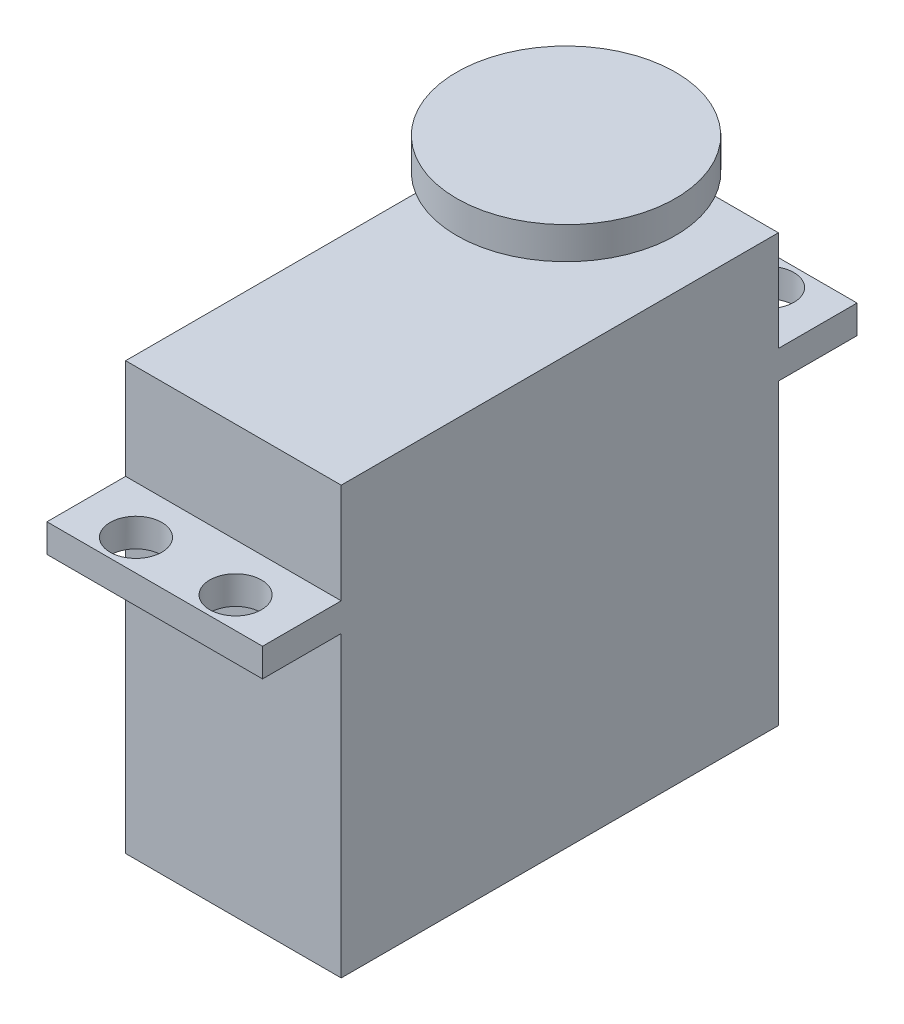
ISO-10303-21;
HEADER;
FILE_DESCRIPTION(('STEP AP214'),'2;1');
FILE_NAME('part.step','',(''),(''),'','','');
FILE_SCHEMA(('AUTOMOTIVE_DESIGN { 1 0 10303 214 1 1 1 1 }'));
ENDSEC;
DATA;
#1=APPLICATION_CONTEXT('core data for automotive mechanical design processes');
#2=APPLICATION_PROTOCOL_DEFINITION('international standard','automotive_design',2000,#1);
#3=PRODUCT_CONTEXT('',#1,'mechanical');
#4=PRODUCT('Part','Part','',(#3));
#5=PRODUCT_RELATED_PRODUCT_CATEGORY('part','',(#4));
#6=PRODUCT_DEFINITION_FORMATION('','',#4);
#7=PRODUCT_DEFINITION_CONTEXT('part definition',#1,'design');
#8=PRODUCT_DEFINITION('design','',#6,#7);
#9=PRODUCT_DEFINITION_SHAPE('','',#8);
#10=(LENGTH_UNIT() NAMED_UNIT(*) SI_UNIT(.MILLI.,.METRE.));
#11=(NAMED_UNIT(*) PLANE_ANGLE_UNIT() SI_UNIT($,.RADIAN.));
#12=(NAMED_UNIT(*) SI_UNIT($,.STERADIAN.) SOLID_ANGLE_UNIT());
#13=UNCERTAINTY_MEASURE_WITH_UNIT(LENGTH_MEASURE(1.E-05),#10,'distance_accuracy_value','');
#14=(GEOMETRIC_REPRESENTATION_CONTEXT(3) GLOBAL_UNCERTAINTY_ASSIGNED_CONTEXT((#13)) GLOBAL_UNIT_ASSIGNED_CONTEXT((#10,
#11,#12)) REPRESENTATION_CONTEXT('',''));
#15=CARTESIAN_POINT('',(0.,0.,0.));
#16=DIRECTION('',(0.,0.,1.));
#17=DIRECTION('',(1.,0.,0.));
#18=AXIS2_PLACEMENT_3D('',#15,#16,#17);
#19=CARTESIAN_POINT('',(-9.9,39.2,20.075));
#20=DIRECTION('',(0.,0.,-1.));
#21=DIRECTION('',(-1.,0.,0.));
#22=AXIS2_PLACEMENT_3D('',#19,#20,#21);
#23=PLANE('',#22);
#24=DIRECTION('',(0.,-1.,0.));
#25=VECTOR('',#24,1.);
#26=CARTESIAN_POINT('',(9.9,39.2,20.075));
#27=LINE('',#26,#25);
#28=CARTESIAN_POINT('',(9.9,27.4,20.075));
#29=VERTEX_POINT('',#28);
#30=CARTESIAN_POINT('',(9.9,0.,20.075));
#31=VERTEX_POINT('',#30);
#32=EDGE_CURVE('E212',#29,#31,#27,.T.);
#33=ORIENTED_EDGE('',*,*,#32,.F.);
#34=DIRECTION('',(-1.,0.,0.));
#35=VECTOR('',#34,1.);
#36=CARTESIAN_POINT('',(9.9,27.4,20.075));
#37=LINE('',#36,#35);
#38=CARTESIAN_POINT('',(-9.90000000000001,27.4,20.075));
#39=VERTEX_POINT('',#38);
#40=EDGE_CURVE('E146',#29,#39,#37,.T.);
#41=ORIENTED_EDGE('',*,*,#40,.T.);
#42=DIRECTION('',(0.,-1.,0.));
#43=VECTOR('',#42,1.);
#44=CARTESIAN_POINT('',(-9.9,39.2,20.075));
#45=LINE('',#44,#43);
#46=CARTESIAN_POINT('',(-9.9,0.,20.075));
#47=VERTEX_POINT('',#46);
#48=EDGE_CURVE('E223',#39,#47,#45,.T.);
#49=ORIENTED_EDGE('',*,*,#48,.T.);
#50=DIRECTION('',(1.,0.,0.));
#51=VECTOR('',#50,1.);
#52=CARTESIAN_POINT('',(-9.9,0.,20.075));
#53=LINE('',#52,#51);
#54=EDGE_CURVE('E206',#47,#31,#53,.T.);
#55=ORIENTED_EDGE('',*,*,#54,.T.);
#56=EDGE_LOOP('',(#33,#41,#49,#55));
#57=FACE_BOUND('',#56,.T.);
#58=ADVANCED_FACE('F39',(#57),#23,.F.);
#59=CARTESIAN_POINT('',(-9.90000000000001,39.2,-20.075));
#60=DIRECTION('',(0.,0.,1.));
#61=DIRECTION('',(1.,0.,0.));
#62=AXIS2_PLACEMENT_3D('',#59,#60,#61);
#63=PLANE('',#62);
#64=DIRECTION('',(1.,0.,0.));
#65=VECTOR('',#64,1.);
#66=CARTESIAN_POINT('',(9.9,30.,-20.075));
#67=LINE('',#66,#65);
#68=CARTESIAN_POINT('',(-9.90000000000001,30.,-20.075));
#69=VERTEX_POINT('',#68);
#70=CARTESIAN_POINT('',(9.9,30.,-20.075));
#71=VERTEX_POINT('',#70);
#72=EDGE_CURVE('E180',#69,#71,#67,.T.);
#73=ORIENTED_EDGE('',*,*,#72,.F.);
#74=DIRECTION('',(0.,-1.,0.));
#75=VECTOR('',#74,1.);
#76=CARTESIAN_POINT('',(-9.90000000000001,39.2,-20.075));
#77=LINE('',#76,#75);
#78=CARTESIAN_POINT('',(-9.90000000000001,39.2,-20.075));
#79=VERTEX_POINT('',#78);
#80=EDGE_CURVE('E227',#79,#69,#77,.T.);
#81=ORIENTED_EDGE('',*,*,#80,.F.);
#82=DIRECTION('',(-1.,0.,0.));
#83=VECTOR('',#82,1.);
#84=CARTESIAN_POINT('',(-9.90000000000001,39.2,-20.075));
#85=LINE('',#84,#83);
#86=CARTESIAN_POINT('',(9.9,39.2,-20.075));
#87=VERTEX_POINT('',#86);
#88=EDGE_CURVE('E205',#87,#79,#85,.T.);
#89=ORIENTED_EDGE('',*,*,#88,.F.);
#90=DIRECTION('',(0.,-1.,0.));
#91=VECTOR('',#90,1.);
#92=CARTESIAN_POINT('',(9.9,39.2,-20.075));
#93=LINE('',#92,#91);
#94=EDGE_CURVE('E11',#87,#71,#93,.T.);
#95=ORIENTED_EDGE('',*,*,#94,.T.);
#96=EDGE_LOOP('',(#73,#81,#89,#95));
#97=FACE_BOUND('',#96,.T.);
#98=ADVANCED_FACE('F261',(#97),#63,.F.);
#99=DIRECTION('',(-1.,0.,0.));
#100=VECTOR('',#99,1.);
#101=CARTESIAN_POINT('',(9.9,27.4,-20.075));
#102=LINE('',#101,#100);
#103=CARTESIAN_POINT('',(9.9,27.4,-20.075));
#104=VERTEX_POINT('',#103);
#105=CARTESIAN_POINT('',(-9.90000000000001,27.4,-20.075));
#106=VERTEX_POINT('',#105);
#107=EDGE_CURVE('E62',#104,#106,#102,.T.);
#108=ORIENTED_EDGE('',*,*,#107,.F.);
#109=CARTESIAN_POINT('',(9.9,0.,-20.075));
#110=VERTEX_POINT('',#109);
#111=EDGE_CURVE('E47',#104,#110,#93,.T.);
#112=ORIENTED_EDGE('',*,*,#111,.T.);
#113=DIRECTION('',(-1.,0.,0.));
#114=VECTOR('',#113,1.);
#115=CARTESIAN_POINT('',(-9.90000000000001,0.,-20.075));
#116=LINE('',#115,#114);
#117=CARTESIAN_POINT('',(-9.90000000000001,0.,-20.075));
#118=VERTEX_POINT('',#117);
#119=EDGE_CURVE('E214',#110,#118,#116,.T.);
#120=ORIENTED_EDGE('',*,*,#119,.T.);
#121=EDGE_CURVE('E226',#106,#118,#77,.T.);
#122=ORIENTED_EDGE('',*,*,#121,.F.);
#123=EDGE_LOOP('',(#108,#112,#120,#122));
#124=FACE_BOUND('',#123,.T.);
#125=ADVANCED_FACE('F240',(#124),#63,.F.);
#126=CARTESIAN_POINT('',(9.9,39.2,-20.075));
#127=DIRECTION('',(-1.,0.,0.));
#128=DIRECTION('',(0.,0.,1.));
#129=AXIS2_PLACEMENT_3D('',#126,#127,#128);
#130=PLANE('',#129);
#131=DIRECTION('',(0.,0.,-1.));
#132=VECTOR('',#131,1.);
#133=CARTESIAN_POINT('',(9.9,0.,-20.075));
#134=LINE('',#133,#132);
#135=EDGE_CURVE('E201',#31,#110,#134,.T.);
#136=ORIENTED_EDGE('',*,*,#135,.T.);
#137=ORIENTED_EDGE('',*,*,#111,.F.);
#138=DIRECTION('',(0.,0.,1.));
#139=VECTOR('',#138,1.);
#140=CARTESIAN_POINT('',(9.9,27.4,-27.3));
#141=LINE('',#140,#139);
#142=CARTESIAN_POINT('',(9.9,27.4,-27.3));
#143=VERTEX_POINT('',#142);
#144=EDGE_CURVE('E198',#143,#104,#141,.T.);
#145=ORIENTED_EDGE('',*,*,#144,.F.);
#146=DIRECTION('',(0.,-1.,0.));
#147=VECTOR('',#146,1.);
#148=CARTESIAN_POINT('',(9.9,27.4,-27.3));
#149=LINE('',#148,#147);
#150=CARTESIAN_POINT('',(9.9,30.,-27.3));
#151=VERTEX_POINT('',#150);
#152=EDGE_CURVE('E176',#151,#143,#149,.T.);
#153=ORIENTED_EDGE('',*,*,#152,.F.);
#154=DIRECTION('',(0.,0.,1.));
#155=VECTOR('',#154,1.);
#156=CARTESIAN_POINT('',(9.9,30.,-27.3));
#157=LINE('',#156,#155);
#158=EDGE_CURVE('E186',#151,#71,#157,.T.);
#159=ORIENTED_EDGE('',*,*,#158,.T.);
#160=ORIENTED_EDGE('',*,*,#94,.F.);
#161=DIRECTION('',(0.,0.,-1.));
#162=VECTOR('',#161,1.);
#163=CARTESIAN_POINT('',(9.9,39.2,-20.075));
#164=LINE('',#163,#162);
#165=CARTESIAN_POINT('',(9.9,39.2,20.075));
#166=VERTEX_POINT('',#165);
#167=EDGE_CURVE('E202',#166,#87,#164,.T.);
#168=ORIENTED_EDGE('',*,*,#167,.F.);
#169=CARTESIAN_POINT('',(9.9,30.,20.075));
#170=VERTEX_POINT('',#169);
#171=EDGE_CURVE('E134',#166,#170,#27,.T.);
#172=ORIENTED_EDGE('',*,*,#171,.T.);
#173=DIRECTION('',(0.,0.,-1.));
#174=VECTOR('',#173,1.);
#175=CARTESIAN_POINT('',(9.9,30.,27.3));
#176=LINE('',#175,#174);
#177=CARTESIAN_POINT('',(9.9,30.,27.3));
#178=VERTEX_POINT('',#177);
#179=EDGE_CURVE('E54',#178,#170,#176,.T.);
#180=ORIENTED_EDGE('',*,*,#179,.F.);
#181=DIRECTION('',(0.,-1.,0.));
#182=VECTOR('',#181,1.);
#183=CARTESIAN_POINT('',(9.9,27.4,27.3));
#184=LINE('',#183,#182);
#185=CARTESIAN_POINT('',(9.9,27.4,27.3));
#186=VERTEX_POINT('',#185);
#187=EDGE_CURVE('E130',#178,#186,#184,.T.);
#188=ORIENTED_EDGE('',*,*,#187,.T.);
#189=DIRECTION('',(0.,0.,-1.));
#190=VECTOR('',#189,1.);
#191=CARTESIAN_POINT('',(9.9,27.4,27.3));
#192=LINE('',#191,#190);
#193=EDGE_CURVE('E155',#186,#29,#192,.T.);
#194=ORIENTED_EDGE('',*,*,#193,.T.);
#195=ORIENTED_EDGE('',*,*,#32,.T.);
#196=EDGE_LOOP('',(#136,#137,#145,#153,#159,#160,#168,#172,#180,#188,#194,#195));
#197=FACE_BOUND('',#196,.T.);
#198=ADVANCED_FACE('F41',(#197),#130,.F.);
#199=CARTESIAN_POINT('',(-9.90000000000001,39.2,-20.075));
#200=DIRECTION('',(1.,0.,0.));
#201=DIRECTION('',(0.,0.,-1.));
#202=AXIS2_PLACEMENT_3D('',#199,#200,#201);
#203=PLANE('',#202);
#204=DIRECTION('',(0.,0.,1.));
#205=VECTOR('',#204,1.);
#206=CARTESIAN_POINT('',(-9.90000000000001,0.,-20.075));
#207=LINE('',#206,#205);
#208=EDGE_CURVE('E217',#118,#47,#207,.T.);
#209=ORIENTED_EDGE('',*,*,#208,.T.);
#210=ORIENTED_EDGE('',*,*,#48,.F.);
#211=DIRECTION('',(0.,0.,-1.));
#212=VECTOR('',#211,1.);
#213=CARTESIAN_POINT('',(-9.90000000000001,27.4,27.3));
#214=LINE('',#213,#212);
#215=CARTESIAN_POINT('',(-9.90000000000001,27.4,27.3));
#216=VERTEX_POINT('',#215);
#217=EDGE_CURVE('E162',#216,#39,#214,.T.);
#218=ORIENTED_EDGE('',*,*,#217,.F.);
#219=DIRECTION('',(0.,1.,0.));
#220=VECTOR('',#219,1.);
#221=CARTESIAN_POINT('',(-9.90000000000001,27.4,27.3));
#222=LINE('',#221,#220);
#223=CARTESIAN_POINT('',(-9.90000000000001,30.,27.3));
#224=VERTEX_POINT('',#223);
#225=EDGE_CURVE('E149',#216,#224,#222,.T.);
#226=ORIENTED_EDGE('',*,*,#225,.T.);
#227=DIRECTION('',(0.,0.,-1.));
#228=VECTOR('',#227,1.);
#229=CARTESIAN_POINT('',(-9.90000000000001,30.,27.3));
#230=LINE('',#229,#228);
#231=CARTESIAN_POINT('',(-9.90000000000001,30.,20.075));
#232=VERTEX_POINT('',#231);
#233=EDGE_CURVE('E136',#224,#232,#230,.T.);
#234=ORIENTED_EDGE('',*,*,#233,.T.);
#235=CARTESIAN_POINT('',(-9.9,39.2,20.075));
#236=VERTEX_POINT('',#235);
#237=EDGE_CURVE('E224',#236,#232,#45,.T.);
#238=ORIENTED_EDGE('',*,*,#237,.F.);
#239=DIRECTION('',(0.,0.,1.));
#240=VECTOR('',#239,1.);
#241=CARTESIAN_POINT('',(-9.90000000000001,39.2,-20.075));
#242=LINE('',#241,#240);
#243=EDGE_CURVE('E208',#79,#236,#242,.T.);
#244=ORIENTED_EDGE('',*,*,#243,.F.);
#245=ORIENTED_EDGE('',*,*,#80,.T.);
#246=DIRECTION('',(0.,0.,1.));
#247=VECTOR('',#246,1.);
#248=CARTESIAN_POINT('',(-9.90000000000001,30.,-27.3));
#249=LINE('',#248,#247);
#250=CARTESIAN_POINT('',(-9.90000000000001,30.,-27.3));
#251=VERTEX_POINT('',#250);
#252=EDGE_CURVE('E192',#251,#69,#249,.T.);
#253=ORIENTED_EDGE('',*,*,#252,.F.);
#254=DIRECTION('',(0.,1.,0.));
#255=VECTOR('',#254,1.);
#256=CARTESIAN_POINT('',(-9.90000000000001,27.4,-27.3));
#257=LINE('',#256,#255);
#258=CARTESIAN_POINT('',(-9.90000000000001,27.4,-27.3));
#259=VERTEX_POINT('',#258);
#260=EDGE_CURVE('E182',#259,#251,#257,.T.);
#261=ORIENTED_EDGE('',*,*,#260,.F.);
#262=DIRECTION('',(0.,0.,1.));
#263=VECTOR('',#262,1.);
#264=CARTESIAN_POINT('',(-9.90000000000001,27.4,-27.3));
#265=LINE('',#264,#263);
#266=EDGE_CURVE('E195',#259,#106,#265,.T.);
#267=ORIENTED_EDGE('',*,*,#266,.T.);
#268=ORIENTED_EDGE('',*,*,#121,.T.);
#269=EDGE_LOOP('',(#209,#210,#218,#226,#234,#238,#244,#245,#253,#261,#267,#268));
#270=FACE_BOUND('',#269,.T.);
#271=ADVANCED_FACE('F233',(#270),#203,.F.);
#272=ORIENTED_EDGE('',*,*,#237,.T.);
#273=DIRECTION('',(1.,0.,0.));
#274=VECTOR('',#273,1.);
#275=CARTESIAN_POINT('',(9.9,30.,20.075));
#276=LINE('',#275,#274);
#277=EDGE_CURVE('E156',#232,#170,#276,.T.);
#278=ORIENTED_EDGE('',*,*,#277,.T.);
#279=ORIENTED_EDGE('',*,*,#171,.F.);
#280=DIRECTION('',(1.,0.,0.));
#281=VECTOR('',#280,1.);
#282=CARTESIAN_POINT('',(-9.9,39.2,20.075));
#283=LINE('',#282,#281);
#284=EDGE_CURVE('E210',#236,#166,#283,.T.);
#285=ORIENTED_EDGE('',*,*,#284,.F.);
#286=EDGE_LOOP('',(#272,#278,#279,#285));
#287=FACE_BOUND('',#286,.T.);
#288=ADVANCED_FACE('F267',(#287),#23,.F.);
#289=CARTESIAN_POINT('',(0.,39.2,0.));
#290=DIRECTION('',(0.,1.,0.));
#291=DIRECTION('',(0.,0.,1.));
#292=AXIS2_PLACEMENT_3D('',#289,#290,#291);
#293=PLANE('',#292);
#294=CARTESIAN_POINT('',(0.,39.2,-10.475));
#295=DIRECTION('',(0.,1.,0.));
#296=DIRECTION('',(0.,0.,1.));
#297=AXIS2_PLACEMENT_3D('',#294,#295,#296);
#298=CIRCLE('',#297,2.825);
#299=CARTESIAN_POINT('',(0.,39.2,-7.65000000000001));
#300=VERTEX_POINT('',#299);
#301=EDGE_CURVE('E572',#300,#300,#298,.T.);
#302=ORIENTED_EDGE('',*,*,#301,.F.);
#303=EDGE_LOOP('',(#302));
#304=FACE_BOUND('',#303,.T.);
#305=ORIENTED_EDGE('',*,*,#167,.T.);
#306=ORIENTED_EDGE('',*,*,#88,.T.);
#307=ORIENTED_EDGE('',*,*,#243,.T.);
#308=ORIENTED_EDGE('',*,*,#284,.T.);
#309=EDGE_LOOP('',(#305,#306,#307,#308));
#310=FACE_BOUND('',#309,.T.);
#311=ADVANCED_FACE('F263',(#304,#310),#293,.T.);
#312=CARTESIAN_POINT('',(0.,0.,0.));
#313=DIRECTION('',(0.,1.,0.));
#314=DIRECTION('',(0.,0.,1.));
#315=AXIS2_PLACEMENT_3D('',#312,#313,#314);
#316=PLANE('',#315);
#317=ORIENTED_EDGE('',*,*,#135,.F.);
#318=ORIENTED_EDGE('',*,*,#54,.F.);
#319=ORIENTED_EDGE('',*,*,#208,.F.);
#320=ORIENTED_EDGE('',*,*,#119,.F.);
#321=EDGE_LOOP('',(#317,#318,#319,#320));
#322=FACE_BOUND('',#321,.T.);
#323=ADVANCED_FACE('F243',(#322),#316,.F.);
#324=CARTESIAN_POINT('',(9.9,27.4,-27.3));
#325=DIRECTION('',(0.,1.,0.));
#326=DIRECTION('',(0.,0.,1.));
#327=AXIS2_PLACEMENT_3D('',#324,#325,#326);
#328=PLANE('',#327);
#329=CARTESIAN_POINT('',(4.575,27.4,-24.45));
#330=DIRECTION('',(0.,1.,0.));
#331=DIRECTION('',(0.,0.,1.));
#332=AXIS2_PLACEMENT_3D('',#329,#330,#331);
#333=CIRCLE('',#332,2.375);
#334=CARTESIAN_POINT('',(4.575,27.4,-22.075));
#335=VERTEX_POINT('',#334);
#336=EDGE_CURVE('E168',#335,#335,#333,.F.);
#337=ORIENTED_EDGE('',*,*,#336,.F.);
#338=EDGE_LOOP('',(#337));
#339=FACE_BOUND('',#338,.T.);
#340=CARTESIAN_POINT('',(-4.57500000000001,27.4,-24.45));
#341=DIRECTION('',(0.,1.,0.));
#342=DIRECTION('',(0.,0.,1.));
#343=AXIS2_PLACEMENT_3D('',#340,#341,#342);
#344=CIRCLE('',#343,2.375);
#345=CARTESIAN_POINT('',(-4.57500000000001,27.4,-22.075));
#346=VERTEX_POINT('',#345);
#347=EDGE_CURVE('E135',#346,#346,#344,.F.);
#348=ORIENTED_EDGE('',*,*,#347,.F.);
#349=EDGE_LOOP('',(#348));
#350=FACE_BOUND('',#349,.T.);
#351=ORIENTED_EDGE('',*,*,#107,.T.);
#352=ORIENTED_EDGE('',*,*,#266,.F.);
#353=DIRECTION('',(-1.,0.,0.));
#354=VECTOR('',#353,1.);
#355=CARTESIAN_POINT('',(9.9,27.4,-27.3));
#356=LINE('',#355,#354);
#357=EDGE_CURVE('E179',#143,#259,#356,.T.);
#358=ORIENTED_EDGE('',*,*,#357,.F.);
#359=ORIENTED_EDGE('',*,*,#144,.T.);
#360=EDGE_LOOP('',(#351,#352,#358,#359));
#361=FACE_BOUND('',#360,.T.);
#362=ADVANCED_FACE('F252',(#339,#350,#361),#328,.F.);
#363=CARTESIAN_POINT('',(9.9,30.,-27.3));
#364=DIRECTION('',(0.,-1.,0.));
#365=DIRECTION('',(0.,0.,-1.));
#366=AXIS2_PLACEMENT_3D('',#363,#364,#365);
#367=PLANE('',#366);
#368=CARTESIAN_POINT('',(4.575,30.,-24.45));
#369=DIRECTION('',(0.,1.,0.));
#370=DIRECTION('',(0.,0.,1.));
#371=AXIS2_PLACEMENT_3D('',#368,#369,#370);
#372=CIRCLE('',#371,2.375);
#373=CARTESIAN_POINT('',(4.575,30.,-22.075));
#374=VERTEX_POINT('',#373);
#375=EDGE_CURVE('E165',#374,#374,#372,.T.);
#376=ORIENTED_EDGE('',*,*,#375,.F.);
#377=EDGE_LOOP('',(#376));
#378=FACE_BOUND('',#377,.T.);
#379=CARTESIAN_POINT('',(-4.57500000000001,30.,-24.45));
#380=DIRECTION('',(0.,1.,0.));
#381=DIRECTION('',(0.,0.,-1.));
#382=AXIS2_PLACEMENT_3D('',#379,#380,#381);
#383=CIRCLE('',#382,2.375);
#384=CARTESIAN_POINT('',(-4.57500000000001,30.,-26.825));
#385=VERTEX_POINT('',#384);
#386=EDGE_CURVE('E169',#385,#385,#383,.T.);
#387=ORIENTED_EDGE('',*,*,#386,.F.);
#388=EDGE_LOOP('',(#387));
#389=FACE_BOUND('',#388,.T.);
#390=ORIENTED_EDGE('',*,*,#72,.T.);
#391=ORIENTED_EDGE('',*,*,#158,.F.);
#392=DIRECTION('',(1.,0.,0.));
#393=VECTOR('',#392,1.);
#394=CARTESIAN_POINT('',(9.9,30.,-27.3));
#395=LINE('',#394,#393);
#396=EDGE_CURVE('E184',#251,#151,#395,.T.);
#397=ORIENTED_EDGE('',*,*,#396,.F.);
#398=ORIENTED_EDGE('',*,*,#252,.T.);
#399=EDGE_LOOP('',(#390,#391,#397,#398));
#400=FACE_BOUND('',#399,.T.);
#401=ADVANCED_FACE('F259',(#378,#389,#400),#367,.F.);
#402=CARTESIAN_POINT('',(0.,0.,-27.3));
#403=DIRECTION('',(0.,0.,1.));
#404=DIRECTION('',(1.,0.,0.));
#405=AXIS2_PLACEMENT_3D('',#402,#403,#404);
#406=PLANE('',#405);
#407=ORIENTED_EDGE('',*,*,#152,.T.);
#408=ORIENTED_EDGE('',*,*,#357,.T.);
#409=ORIENTED_EDGE('',*,*,#260,.T.);
#410=ORIENTED_EDGE('',*,*,#396,.T.);
#411=EDGE_LOOP('',(#407,#408,#409,#410));
#412=FACE_BOUND('',#411,.T.);
#413=ADVANCED_FACE('F254',(#412),#406,.F.);
#414=CARTESIAN_POINT('',(-4.57500000000001,-0.001000000000001,-24.45));
#415=DIRECTION('',(0.,1.,0.));
#416=DIRECTION('',(0.,0.,1.));
#417=AXIS2_PLACEMENT_3D('',#414,#415,#416);
#418=CYLINDRICAL_SURFACE('',#417,2.375);
#419=ORIENTED_EDGE('',*,*,#386,.T.);
#420=EDGE_LOOP('',(#419));
#421=FACE_BOUND('',#420,.T.);
#422=ORIENTED_EDGE('',*,*,#347,.T.);
#423=EDGE_LOOP('',(#422));
#424=FACE_BOUND('',#423,.T.);
#425=ADVANCED_FACE('F343',(#421,#424),#418,.F.);
#426=CARTESIAN_POINT('',(4.575,-0.001000000000001,-24.45));
#427=DIRECTION('',(0.,1.,0.));
#428=DIRECTION('',(0.,0.,1.));
#429=AXIS2_PLACEMENT_3D('',#426,#427,#428);
#430=CYLINDRICAL_SURFACE('',#429,2.375);
#431=ORIENTED_EDGE('',*,*,#375,.T.);
#432=EDGE_LOOP('',(#431));
#433=FACE_BOUND('',#432,.T.);
#434=ORIENTED_EDGE('',*,*,#336,.T.);
#435=EDGE_LOOP('',(#434));
#436=FACE_BOUND('',#435,.T.);
#437=ADVANCED_FACE('F352',(#433,#436),#430,.F.);
#438=CARTESIAN_POINT('',(9.9,30.,27.3));
#439=DIRECTION('',(0.,1.,0.));
#440=DIRECTION('',(0.,0.,1.));
#441=AXIS2_PLACEMENT_3D('',#438,#439,#440);
#442=PLANE('',#441);
#443=CARTESIAN_POINT('',(4.575,30.,24.45));
#444=DIRECTION('',(0.,-1.,0.));
#445=DIRECTION('',(0.,0.,-1.));
#446=AXIS2_PLACEMENT_3D('',#443,#444,#445);
#447=CIRCLE('',#446,2.375);
#448=CARTESIAN_POINT('',(4.575,30.,22.075));
#449=VERTEX_POINT('',#448);
#450=EDGE_CURVE('E579',#449,#449,#447,.T.);
#451=ORIENTED_EDGE('',*,*,#450,.T.);
#452=EDGE_LOOP('',(#451));
#453=FACE_BOUND('',#452,.T.);
#454=CARTESIAN_POINT('',(-4.57500000000001,30.,24.45));
#455=DIRECTION('',(0.,-1.,0.));
#456=DIRECTION('',(0.,0.,1.));
#457=AXIS2_PLACEMENT_3D('',#454,#455,#456);
#458=CIRCLE('',#457,2.375);
#459=CARTESIAN_POINT('',(-4.57500000000001,30.,26.825));
#460=VERTEX_POINT('',#459);
#461=EDGE_CURVE('E576',#460,#460,#458,.T.);
#462=ORIENTED_EDGE('',*,*,#461,.T.);
#463=EDGE_LOOP('',(#462));
#464=FACE_BOUND('',#463,.T.);
#465=ORIENTED_EDGE('',*,*,#277,.F.);
#466=ORIENTED_EDGE('',*,*,#233,.F.);
#467=DIRECTION('',(1.,0.,0.));
#468=VECTOR('',#467,1.);
#469=CARTESIAN_POINT('',(9.9,30.,27.3));
#470=LINE('',#469,#468);
#471=EDGE_CURVE('E142',#224,#178,#470,.T.);
#472=ORIENTED_EDGE('',*,*,#471,.T.);
#473=ORIENTED_EDGE('',*,*,#179,.T.);
#474=EDGE_LOOP('',(#465,#466,#472,#473));
#475=FACE_BOUND('',#474,.T.);
#476=ADVANCED_FACE('F148',(#453,#464,#475),#442,.T.);
#477=CARTESIAN_POINT('',(9.9,27.4,27.3));
#478=DIRECTION('',(0.,-1.,0.));
#479=DIRECTION('',(0.,0.,-1.));
#480=AXIS2_PLACEMENT_3D('',#477,#478,#479);
#481=PLANE('',#480);
#482=CARTESIAN_POINT('',(4.575,27.4,24.45));
#483=DIRECTION('',(0.,-1.,0.));
#484=DIRECTION('',(0.,0.,-1.));
#485=AXIS2_PLACEMENT_3D('',#482,#483,#484);
#486=CIRCLE('',#485,2.375);
#487=CARTESIAN_POINT('',(4.575,27.4,22.075));
#488=VERTEX_POINT('',#487);
#489=EDGE_CURVE('E158',#488,#488,#486,.T.);
#490=ORIENTED_EDGE('',*,*,#489,.F.);
#491=EDGE_LOOP('',(#490));
#492=FACE_BOUND('',#491,.T.);
#493=CARTESIAN_POINT('',(-4.57500000000001,27.4,24.45));
#494=DIRECTION('',(0.,-1.,0.));
#495=DIRECTION('',(0.,0.,-1.));
#496=AXIS2_PLACEMENT_3D('',#493,#494,#495);
#497=CIRCLE('',#496,2.375);
#498=CARTESIAN_POINT('',(-4.57500000000001,27.4,22.075));
#499=VERTEX_POINT('',#498);
#500=EDGE_CURVE('E582',#499,#499,#497,.T.);
#501=ORIENTED_EDGE('',*,*,#500,.F.);
#502=EDGE_LOOP('',(#501));
#503=FACE_BOUND('',#502,.T.);
#504=ORIENTED_EDGE('',*,*,#40,.F.);
#505=ORIENTED_EDGE('',*,*,#193,.F.);
#506=DIRECTION('',(-1.,0.,0.));
#507=VECTOR('',#506,1.);
#508=CARTESIAN_POINT('',(9.9,27.4,27.3));
#509=LINE('',#508,#507);
#510=EDGE_CURVE('E145',#186,#216,#509,.T.);
#511=ORIENTED_EDGE('',*,*,#510,.T.);
#512=ORIENTED_EDGE('',*,*,#217,.T.);
#513=EDGE_LOOP('',(#504,#505,#511,#512));
#514=FACE_BOUND('',#513,.T.);
#515=ADVANCED_FACE('F248',(#492,#503,#514),#481,.T.);
#516=CARTESIAN_POINT('',(0.,0.,27.3));
#517=DIRECTION('',(0.,0.,-1.));
#518=DIRECTION('',(1.,0.,0.));
#519=AXIS2_PLACEMENT_3D('',#516,#517,#518);
#520=PLANE('',#519);
#521=ORIENTED_EDGE('',*,*,#187,.F.);
#522=ORIENTED_EDGE('',*,*,#471,.F.);
#523=ORIENTED_EDGE('',*,*,#225,.F.);
#524=ORIENTED_EDGE('',*,*,#510,.F.);
#525=EDGE_LOOP('',(#521,#522,#523,#524));
#526=FACE_BOUND('',#525,.T.);
#527=ADVANCED_FACE('F140',(#526),#520,.F.);
#528=CARTESIAN_POINT('',(-4.57500000000001,-0.001000000000001,24.45));
#529=DIRECTION('',(0.,1.,0.));
#530=DIRECTION('',(0.,0.,1.));
#531=AXIS2_PLACEMENT_3D('',#528,#529,#530);
#532=CYLINDRICAL_SURFACE('',#531,2.375);
#533=ORIENTED_EDGE('',*,*,#500,.T.);
#534=EDGE_LOOP('',(#533));
#535=FACE_BOUND('',#534,.T.);
#536=ORIENTED_EDGE('',*,*,#461,.F.);
#537=EDGE_LOOP('',(#536));
#538=FACE_BOUND('',#537,.T.);
#539=ADVANCED_FACE('F389',(#535,#538),#532,.F.);
#540=CARTESIAN_POINT('',(4.575,-0.001000000000001,24.45));
#541=DIRECTION('',(0.,1.,0.));
#542=DIRECTION('',(0.,0.,1.));
#543=AXIS2_PLACEMENT_3D('',#540,#541,#542);
#544=CYLINDRICAL_SURFACE('',#543,2.375);
#545=ORIENTED_EDGE('',*,*,#489,.T.);
#546=EDGE_LOOP('',(#545));
#547=FACE_BOUND('',#546,.T.);
#548=ORIENTED_EDGE('',*,*,#450,.F.);
#549=EDGE_LOOP('',(#548));
#550=FACE_BOUND('',#549,.T.);
#551=ADVANCED_FACE('F398',(#547,#550),#544,.F.);
#552=CARTESIAN_POINT('',(0.,43.85,-10.475));
#553=DIRECTION('',(0.,-1.,0.));
#554=DIRECTION('',(0.,0.,-1.));
#555=AXIS2_PLACEMENT_3D('',#552,#553,#554);
#556=CYLINDRICAL_SURFACE('',#555,2.825);
#557=CARTESIAN_POINT('',(0.,43.85,-10.475));
#558=DIRECTION('',(0.,1.,0.));
#559=DIRECTION('',(0.,0.,1.));
#560=AXIS2_PLACEMENT_3D('',#557,#558,#559);
#561=CIRCLE('',#560,2.825);
#562=CARTESIAN_POINT('',(0.,43.85,-7.65000000000001));
#563=VERTEX_POINT('',#562);
#564=EDGE_CURVE('E564',#563,#563,#561,.T.);
#565=ORIENTED_EDGE('',*,*,#564,.F.);
#566=EDGE_LOOP('',(#565));
#567=FACE_BOUND('',#566,.T.);
#568=ORIENTED_EDGE('',*,*,#301,.T.);
#569=EDGE_LOOP('',(#568));
#570=FACE_BOUND('',#569,.T.);
#571=ADVANCED_FACE('F407',(#567,#570),#556,.T.);
#572=CARTESIAN_POINT('',(0.,46.8,-10.475));
#573=DIRECTION('',(0.,-1.,0.));
#574=DIRECTION('',(0.,0.,-1.));
#575=AXIS2_PLACEMENT_3D('',#572,#573,#574);
#576=CYLINDRICAL_SURFACE('',#575,10.05);
#577=CARTESIAN_POINT('',(0.,46.8,-10.475));
#578=DIRECTION('',(0.,1.,0.));
#579=DIRECTION('',(0.,0.,1.));
#580=AXIS2_PLACEMENT_3D('',#577,#578,#579);
#581=CIRCLE('',#580,10.05);
#582=CARTESIAN_POINT('',(0.,46.8,-0.425000000000009));
#583=VERTEX_POINT('',#582);
#584=EDGE_CURVE('E569',#583,#583,#581,.T.);
#585=ORIENTED_EDGE('',*,*,#584,.F.);
#586=EDGE_LOOP('',(#585));
#587=FACE_BOUND('',#586,.T.);
#588=CARTESIAN_POINT('',(0.,43.85,-10.475));
#589=DIRECTION('',(0.,1.,0.));
#590=DIRECTION('',(0.,0.,1.));
#591=AXIS2_PLACEMENT_3D('',#588,#589,#590);
#592=CIRCLE('',#591,10.05);
#593=CARTESIAN_POINT('',(0.,43.85,-0.425000000000009));
#594=VERTEX_POINT('',#593);
#595=EDGE_CURVE('E567',#594,#594,#592,.T.);
#596=ORIENTED_EDGE('',*,*,#595,.T.);
#597=EDGE_LOOP('',(#596));
#598=FACE_BOUND('',#597,.T.);
#599=ADVANCED_FACE('F416',(#587,#598),#576,.T.);
#600=CARTESIAN_POINT('',(0.,46.8,-10.475));
#601=DIRECTION('',(0.,1.,0.));
#602=DIRECTION('',(0.,0.,1.));
#603=AXIS2_PLACEMENT_3D('',#600,#601,#602);
#604=PLANE('',#603);
#605=ORIENTED_EDGE('',*,*,#584,.T.);
#606=EDGE_LOOP('',(#605));
#607=FACE_BOUND('',#606,.T.);
#608=ADVANCED_FACE('F426',(#607),#604,.T.);
#609=CARTESIAN_POINT('',(0.,43.85,-10.475));
#610=DIRECTION('',(0.,1.,0.));
#611=DIRECTION('',(0.,0.,1.));
#612=AXIS2_PLACEMENT_3D('',#609,#610,#611);
#613=PLANE('',#612);
#614=ORIENTED_EDGE('',*,*,#564,.T.);
#615=EDGE_LOOP('',(#614));
#616=FACE_BOUND('',#615,.T.);
#617=ORIENTED_EDGE('',*,*,#595,.F.);
#618=EDGE_LOOP('',(#617));
#619=FACE_BOUND('',#618,.T.);
#620=ADVANCED_FACE('F436',(#616,#619),#613,.F.);
#621=CLOSED_SHELL('',(#58,#98,#125,#198,#271,#288,#311,#323,#362,#401,#413,#425,#437,#476,#515,
#527,#539,#551,#571,#599,#608,#620));
#622=MANIFOLD_SOLID_BREP('B2',#621);
#623=ADVANCED_BREP_SHAPE_REPRESENTATION('',(#18,#622),#14);
#624=SHAPE_DEFINITION_REPRESENTATION(#9,#623);
ENDSEC;
END-ISO-10303-21;
